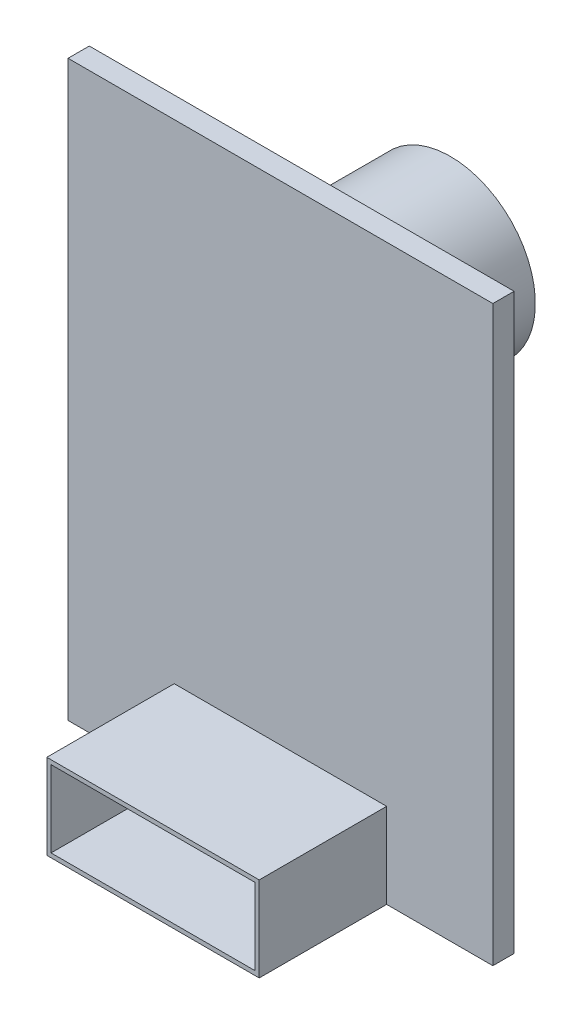
ISO-10303-21;
HEADER;
FILE_DESCRIPTION(('STEP AP214'),'2;1');
FILE_NAME('part.step','',(''),(''),'','','');
FILE_SCHEMA(('AUTOMOTIVE_DESIGN { 1 0 10303 214 1 1 1 1 }'));
ENDSEC;
DATA;
#1=APPLICATION_CONTEXT('core data for automotive mechanical design processes');
#2=APPLICATION_PROTOCOL_DEFINITION('international standard','automotive_design',2000,#1);
#3=PRODUCT_CONTEXT('',#1,'mechanical');
#4=PRODUCT('Part','Part','',(#3));
#5=PRODUCT_RELATED_PRODUCT_CATEGORY('part','',(#4));
#6=PRODUCT_DEFINITION_FORMATION('','',#4);
#7=PRODUCT_DEFINITION_CONTEXT('part definition',#1,'design');
#8=PRODUCT_DEFINITION('design','',#6,#7);
#9=PRODUCT_DEFINITION_SHAPE('','',#8);
#10=(LENGTH_UNIT() NAMED_UNIT(*) SI_UNIT(.MILLI.,.METRE.));
#11=(NAMED_UNIT(*) PLANE_ANGLE_UNIT() SI_UNIT($,.RADIAN.));
#12=(NAMED_UNIT(*) SI_UNIT($,.STERADIAN.) SOLID_ANGLE_UNIT());
#13=UNCERTAINTY_MEASURE_WITH_UNIT(LENGTH_MEASURE(1.E-05),#10,'distance_accuracy_value','');
#14=(GEOMETRIC_REPRESENTATION_CONTEXT(3) GLOBAL_UNCERTAINTY_ASSIGNED_CONTEXT((#13)) GLOBAL_UNIT_ASSIGNED_CONTEXT((#10,
#11,#12)) REPRESENTATION_CONTEXT('',''));
#15=CARTESIAN_POINT('',(0.,0.,0.));
#16=DIRECTION('',(0.,0.,1.));
#17=DIRECTION('',(1.,0.,0.));
#18=AXIS2_PLACEMENT_3D('',#15,#16,#17);
#19=CARTESIAN_POINT('',(0.,0.,-2.));
#20=DIRECTION('',(0.,0.,-1.));
#21=DIRECTION('',(-1.,0.,0.));
#22=AXIS2_PLACEMENT_3D('',#19,#20,#21);
#23=PLANE('',#22);
#24=DIRECTION('',(0.,-1.,0.));
#25=VECTOR('',#24,1.);
#26=CARTESIAN_POINT('',(-4.,10.5,-2.));
#27=LINE('',#26,#25);
#28=CARTESIAN_POINT('',(-4.,6.5,-2.));
#29=VERTEX_POINT('',#28);
#30=CARTESIAN_POINT('',(-4.,2.5,-2.));
#31=VERTEX_POINT('',#30);
#32=EDGE_CURVE('E262',#29,#31,#27,.T.);
#33=ORIENTED_EDGE('',*,*,#32,.F.);
#34=CARTESIAN_POINT('',(0.,6.5,-2.));
#35=DIRECTION('',(0.,0.,-1.));
#36=DIRECTION('',(-1.,0.,0.));
#37=AXIS2_PLACEMENT_3D('',#34,#35,#36);
#38=CIRCLE('',#37,4.);
#39=CARTESIAN_POINT('',(0.,2.5,-2.));
#40=VERTEX_POINT('',#39);
#41=EDGE_CURVE('E12',#29,#40,#38,.F.);
#42=ORIENTED_EDGE('',*,*,#41,.T.);
#43=DIRECTION('',(-1.,0.,0.));
#44=VECTOR('',#43,1.);
#45=CARTESIAN_POINT('',(4.,2.5,-2.));
#46=LINE('',#45,#44);
#47=EDGE_CURVE('E257',#40,#31,#46,.T.);
#48=ORIENTED_EDGE('',*,*,#47,.T.);
#49=EDGE_LOOP('',(#33,#42,#48));
#50=FACE_BOUND('',#49,.T.);
#51=ADVANCED_FACE('F57',(#50),#23,.T.);
#52=CARTESIAN_POINT('',(4.,2.5,-2.));
#53=VERTEX_POINT('',#52);
#54=EDGE_CURVE('E259',#53,#40,#46,.T.);
#55=ORIENTED_EDGE('',*,*,#54,.T.);
#56=CARTESIAN_POINT('',(4.,6.5,-2.));
#57=VERTEX_POINT('',#56);
#58=EDGE_CURVE('E66',#40,#57,#38,.F.);
#59=ORIENTED_EDGE('',*,*,#58,.T.);
#60=DIRECTION('',(0.,-1.,0.));
#61=VECTOR('',#60,1.);
#62=CARTESIAN_POINT('',(4.,10.5,-2.));
#63=LINE('',#62,#61);
#64=EDGE_CURVE('E258',#57,#53,#63,.T.);
#65=ORIENTED_EDGE('',*,*,#64,.T.);
#66=EDGE_LOOP('',(#55,#59,#65));
#67=FACE_BOUND('',#66,.T.);
#68=ADVANCED_FACE('F332',(#67),#23,.T.);
#69=CARTESIAN_POINT('',(4.,10.5,-2.));
#70=VERTEX_POINT('',#69);
#71=EDGE_CURVE('E254',#70,#57,#63,.T.);
#72=ORIENTED_EDGE('',*,*,#71,.T.);
#73=CARTESIAN_POINT('',(0.,10.5,-2.));
#74=VERTEX_POINT('',#73);
#75=EDGE_CURVE('E321',#57,#74,#38,.F.);
#76=ORIENTED_EDGE('',*,*,#75,.T.);
#77=DIRECTION('',(-1.,0.,0.));
#78=VECTOR('',#77,1.);
#79=CARTESIAN_POINT('',(4.,10.5,-2.));
#80=LINE('',#79,#78);
#81=EDGE_CURVE('E267',#70,#74,#80,.T.);
#82=ORIENTED_EDGE('',*,*,#81,.F.);
#83=EDGE_LOOP('',(#72,#76,#82));
#84=FACE_BOUND('',#83,.T.);
#85=ADVANCED_FACE('F339',(#84),#23,.T.);
#86=CARTESIAN_POINT('',(0.,0.,0.));
#87=DIRECTION('',(0.,0.,1.));
#88=DIRECTION('',(1.,0.,0.));
#89=AXIS2_PLACEMENT_3D('',#86,#87,#88);
#90=PLANE('',#89);
#91=DIRECTION('',(0.,1.,0.));
#92=VECTOR('',#91,1.);
#93=CARTESIAN_POINT('',(10.,13.5,0.));
#94=LINE('',#93,#92);
#95=CARTESIAN_POINT('',(10.,-13.5,0.));
#96=VERTEX_POINT('',#95);
#97=CARTESIAN_POINT('',(10.,13.5,0.));
#98=VERTEX_POINT('',#97);
#99=EDGE_CURVE('E289',#96,#98,#94,.T.);
#100=ORIENTED_EDGE('',*,*,#99,.F.);
#101=DIRECTION('',(1.,0.,0.));
#102=VECTOR('',#101,1.);
#103=CARTESIAN_POINT('',(-10.,-13.5,0.));
#104=LINE('',#103,#102);
#105=CARTESIAN_POINT('',(-10.,-13.5,0.));
#106=VERTEX_POINT('',#105);
#107=EDGE_CURVE('E294',#106,#96,#104,.T.);
#108=ORIENTED_EDGE('',*,*,#107,.F.);
#109=DIRECTION('',(0.,-1.,0.));
#110=VECTOR('',#109,1.);
#111=CARTESIAN_POINT('',(-10.,13.5,0.));
#112=LINE('',#111,#110);
#113=CARTESIAN_POINT('',(-10.,13.5,0.));
#114=VERTEX_POINT('',#113);
#115=EDGE_CURVE('E306',#114,#106,#112,.T.);
#116=ORIENTED_EDGE('',*,*,#115,.F.);
#117=DIRECTION('',(-1.,0.,0.));
#118=VECTOR('',#117,1.);
#119=CARTESIAN_POINT('',(-10.,13.5,0.));
#120=LINE('',#119,#118);
#121=EDGE_CURVE('E304',#98,#114,#120,.T.);
#122=ORIENTED_EDGE('',*,*,#121,.F.);
#123=EDGE_LOOP('',(#100,#108,#116,#122));
#124=FACE_BOUND('',#123,.T.);
#125=DIRECTION('',(0.,-1.,0.));
#126=VECTOR('',#125,1.);
#127=CARTESIAN_POINT('',(4.,10.5,0.));
#128=LINE('',#127,#126);
#129=CARTESIAN_POINT('',(4.,10.5,0.));
#130=VERTEX_POINT('',#129);
#131=CARTESIAN_POINT('',(4.,2.5,0.));
#132=VERTEX_POINT('',#131);
#133=EDGE_CURVE('E253',#130,#132,#128,.T.);
#134=ORIENTED_EDGE('',*,*,#133,.F.);
#135=DIRECTION('',(-1.,0.,0.));
#136=VECTOR('',#135,1.);
#137=CARTESIAN_POINT('',(4.,10.5,0.));
#138=LINE('',#137,#136);
#139=CARTESIAN_POINT('',(-4.,10.5,0.));
#140=VERTEX_POINT('',#139);
#141=EDGE_CURVE('E277',#130,#140,#138,.T.);
#142=ORIENTED_EDGE('',*,*,#141,.T.);
#143=DIRECTION('',(0.,-1.,0.));
#144=VECTOR('',#143,1.);
#145=CARTESIAN_POINT('',(-4.,10.5,0.));
#146=LINE('',#145,#144);
#147=CARTESIAN_POINT('',(-4.,2.5,0.));
#148=VERTEX_POINT('',#147);
#149=EDGE_CURVE('E274',#140,#148,#146,.T.);
#150=ORIENTED_EDGE('',*,*,#149,.T.);
#151=DIRECTION('',(-1.,0.,0.));
#152=VECTOR('',#151,1.);
#153=CARTESIAN_POINT('',(4.,2.5,0.));
#154=LINE('',#153,#152);
#155=EDGE_CURVE('E272',#132,#148,#154,.T.);
#156=ORIENTED_EDGE('',*,*,#155,.F.);
#157=EDGE_LOOP('',(#134,#142,#150,#156));
#158=FACE_BOUND('',#157,.T.);
#159=ADVANCED_FACE('F351',(#124,#158),#90,.F.);
#160=CARTESIAN_POINT('',(10.,13.5,1.));
#161=DIRECTION('',(-1.,0.,0.));
#162=DIRECTION('',(0.,-1.,0.));
#163=AXIS2_PLACEMENT_3D('',#160,#161,#162);
#164=PLANE('',#163);
#165=ORIENTED_EDGE('',*,*,#99,.T.);
#166=DIRECTION('',(0.,0.,-1.));
#167=VECTOR('',#166,1.);
#168=CARTESIAN_POINT('',(10.,13.5,1.));
#169=LINE('',#168,#167);
#170=CARTESIAN_POINT('',(10.,13.5,1.));
#171=VERTEX_POINT('',#170);
#172=EDGE_CURVE('E316',#171,#98,#169,.T.);
#173=ORIENTED_EDGE('',*,*,#172,.F.);
#174=DIRECTION('',(0.,1.,0.));
#175=VECTOR('',#174,1.);
#176=CARTESIAN_POINT('',(10.,13.5,1.));
#177=LINE('',#176,#175);
#178=CARTESIAN_POINT('',(10.,-13.5,1.));
#179=VERTEX_POINT('',#178);
#180=EDGE_CURVE('E290',#179,#171,#177,.T.);
#181=ORIENTED_EDGE('',*,*,#180,.F.);
#182=DIRECTION('',(0.,0.,-1.));
#183=VECTOR('',#182,1.);
#184=CARTESIAN_POINT('',(10.,-13.5,1.));
#185=LINE('',#184,#183);
#186=EDGE_CURVE('E301',#179,#96,#185,.T.);
#187=ORIENTED_EDGE('',*,*,#186,.T.);
#188=EDGE_LOOP('',(#165,#173,#181,#187));
#189=FACE_BOUND('',#188,.T.);
#190=ADVANCED_FACE('F59',(#189),#164,.F.);
#191=CARTESIAN_POINT('',(-10.,13.5,1.));
#192=DIRECTION('',(0.,-1.,0.));
#193=DIRECTION('',(0.,0.,-1.));
#194=AXIS2_PLACEMENT_3D('',#191,#192,#193);
#195=PLANE('',#194);
#196=ORIENTED_EDGE('',*,*,#121,.T.);
#197=DIRECTION('',(0.,0.,-1.));
#198=VECTOR('',#197,1.);
#199=CARTESIAN_POINT('',(-10.,13.5,1.));
#200=LINE('',#199,#198);
#201=CARTESIAN_POINT('',(-10.,13.5,1.));
#202=VERTEX_POINT('',#201);
#203=EDGE_CURVE('E314',#202,#114,#200,.T.);
#204=ORIENTED_EDGE('',*,*,#203,.F.);
#205=DIRECTION('',(-1.,0.,0.));
#206=VECTOR('',#205,1.);
#207=CARTESIAN_POINT('',(-10.,13.5,1.));
#208=LINE('',#207,#206);
#209=EDGE_CURVE('E293',#171,#202,#208,.T.);
#210=ORIENTED_EDGE('',*,*,#209,.F.);
#211=ORIENTED_EDGE('',*,*,#172,.T.);
#212=EDGE_LOOP('',(#196,#204,#210,#211));
#213=FACE_BOUND('',#212,.T.);
#214=ADVANCED_FACE('F393',(#213),#195,.F.);
#215=CARTESIAN_POINT('',(-10.,13.5,1.));
#216=DIRECTION('',(1.,0.,0.));
#217=DIRECTION('',(0.,1.,0.));
#218=AXIS2_PLACEMENT_3D('',#215,#216,#217);
#219=PLANE('',#218);
#220=ORIENTED_EDGE('',*,*,#115,.T.);
#221=DIRECTION('',(0.,0.,-1.));
#222=VECTOR('',#221,1.);
#223=CARTESIAN_POINT('',(-10.,-13.5,1.));
#224=LINE('',#223,#222);
#225=CARTESIAN_POINT('',(-10.,-13.5,1.));
#226=VERTEX_POINT('',#225);
#227=EDGE_CURVE('E311',#226,#106,#224,.T.);
#228=ORIENTED_EDGE('',*,*,#227,.F.);
#229=DIRECTION('',(0.,-1.,0.));
#230=VECTOR('',#229,1.);
#231=CARTESIAN_POINT('',(-10.,13.5,1.));
#232=LINE('',#231,#230);
#233=EDGE_CURVE('E296',#202,#226,#232,.T.);
#234=ORIENTED_EDGE('',*,*,#233,.F.);
#235=ORIENTED_EDGE('',*,*,#203,.T.);
#236=EDGE_LOOP('',(#220,#228,#234,#235));
#237=FACE_BOUND('',#236,.T.);
#238=ADVANCED_FACE('F403',(#237),#219,.F.);
#239=CARTESIAN_POINT('',(-10.,-13.5,1.));
#240=DIRECTION('',(0.,1.,0.));
#241=DIRECTION('',(0.,0.,1.));
#242=AXIS2_PLACEMENT_3D('',#239,#240,#241);
#243=PLANE('',#242);
#244=ORIENTED_EDGE('',*,*,#107,.T.);
#245=ORIENTED_EDGE('',*,*,#186,.F.);
#246=DIRECTION('',(1.,0.,0.));
#247=VECTOR('',#246,1.);
#248=CARTESIAN_POINT('',(-10.,-13.5,1.));
#249=LINE('',#248,#247);
#250=CARTESIAN_POINT('',(5.,-13.5,1.));
#251=VERTEX_POINT('',#250);
#252=EDGE_CURVE('E298',#251,#179,#249,.T.);
#253=ORIENTED_EDGE('',*,*,#252,.F.);
#254=DIRECTION('',(0.,0.,-1.));
#255=VECTOR('',#254,1.);
#256=CARTESIAN_POINT('',(5.,-13.5,7.));
#257=LINE('',#256,#255);
#258=CARTESIAN_POINT('',(5.,-13.5,7.));
#259=VERTEX_POINT('',#258);
#260=EDGE_CURVE('E234',#259,#251,#257,.T.);
#261=ORIENTED_EDGE('',*,*,#260,.F.);
#262=DIRECTION('',(1.,0.,0.));
#263=VECTOR('',#262,1.);
#264=CARTESIAN_POINT('',(-5.,-13.5,7.));
#265=LINE('',#264,#263);
#266=CARTESIAN_POINT('',(-5.,-13.5,7.));
#267=VERTEX_POINT('',#266);
#268=EDGE_CURVE('E232',#267,#259,#265,.T.);
#269=ORIENTED_EDGE('',*,*,#268,.F.);
#270=DIRECTION('',(0.,0.,-1.));
#271=VECTOR('',#270,1.);
#272=CARTESIAN_POINT('',(-5.,-13.5,7.));
#273=LINE('',#272,#271);
#274=CARTESIAN_POINT('',(-5.,-13.5,1.));
#275=VERTEX_POINT('',#274);
#276=EDGE_CURVE('E242',#267,#275,#273,.T.);
#277=ORIENTED_EDGE('',*,*,#276,.T.);
#278=EDGE_CURVE('E299',#226,#275,#249,.T.);
#279=ORIENTED_EDGE('',*,*,#278,.F.);
#280=ORIENTED_EDGE('',*,*,#227,.T.);
#281=EDGE_LOOP('',(#244,#245,#253,#261,#269,#277,#279,#280));
#282=FACE_BOUND('',#281,.T.);
#283=ADVANCED_FACE('F400',(#282),#243,.F.);
#284=CARTESIAN_POINT('',(0.,0.,1.));
#285=DIRECTION('',(0.,0.,1.));
#286=DIRECTION('',(1.,0.,0.));
#287=AXIS2_PLACEMENT_3D('',#284,#285,#286);
#288=PLANE('',#287);
#289=DIRECTION('',(0.,1.,0.));
#290=VECTOR('',#289,1.);
#291=CARTESIAN_POINT('',(5.,-9.5,1.));
#292=LINE('',#291,#290);
#293=CARTESIAN_POINT('',(5.,-9.5,1.));
#294=VERTEX_POINT('',#293);
#295=EDGE_CURVE('E200',#251,#294,#292,.T.);
#296=ORIENTED_EDGE('',*,*,#295,.F.);
#297=ORIENTED_EDGE('',*,*,#252,.T.);
#298=ORIENTED_EDGE('',*,*,#180,.T.);
#299=ORIENTED_EDGE('',*,*,#209,.T.);
#300=ORIENTED_EDGE('',*,*,#233,.T.);
#301=ORIENTED_EDGE('',*,*,#278,.T.);
#302=DIRECTION('',(0.,-1.,0.));
#303=VECTOR('',#302,1.);
#304=CARTESIAN_POINT('',(-5.,-9.5,1.));
#305=LINE('',#304,#303);
#306=CARTESIAN_POINT('',(-5.,-9.5,1.));
#307=VERTEX_POINT('',#306);
#308=EDGE_CURVE('E228',#307,#275,#305,.T.);
#309=ORIENTED_EDGE('',*,*,#308,.F.);
#310=DIRECTION('',(-1.,0.,0.));
#311=VECTOR('',#310,1.);
#312=CARTESIAN_POINT('',(-5.,-9.5,1.));
#313=LINE('',#312,#311);
#314=EDGE_CURVE('E73',#294,#307,#313,.T.);
#315=ORIENTED_EDGE('',*,*,#314,.F.);
#316=EDGE_LOOP('',(#296,#297,#298,#299,#300,#301,#309,#315));
#317=FACE_BOUND('',#316,.T.);
#318=ADVANCED_FACE('F398',(#317),#288,.T.);
#319=CARTESIAN_POINT('',(4.,10.5,-2.));
#320=DIRECTION('',(-1.,0.,0.));
#321=DIRECTION('',(0.,0.,1.));
#322=AXIS2_PLACEMENT_3D('',#319,#320,#321);
#323=PLANE('',#322);
#324=ORIENTED_EDGE('',*,*,#133,.T.);
#325=DIRECTION('',(0.,0.,1.));
#326=VECTOR('',#325,1.);
#327=CARTESIAN_POINT('',(4.,2.5,-2.));
#328=LINE('',#327,#326);
#329=EDGE_CURVE('E286',#53,#132,#328,.T.);
#330=ORIENTED_EDGE('',*,*,#329,.F.);
#331=ORIENTED_EDGE('',*,*,#64,.F.);
#332=ORIENTED_EDGE('',*,*,#71,.F.);
#333=DIRECTION('',(0.,0.,1.));
#334=VECTOR('',#333,1.);
#335=CARTESIAN_POINT('',(4.,10.5,-2.));
#336=LINE('',#335,#334);
#337=EDGE_CURVE('E270',#70,#130,#336,.T.);
#338=ORIENTED_EDGE('',*,*,#337,.T.);
#339=EDGE_LOOP('',(#324,#330,#331,#332,#338));
#340=FACE_BOUND('',#339,.T.);
#341=ADVANCED_FACE('F338',(#340),#323,.F.);
#342=CARTESIAN_POINT('',(4.,2.5,-2.));
#343=DIRECTION('',(0.,1.,0.));
#344=DIRECTION('',(0.,0.,1.));
#345=AXIS2_PLACEMENT_3D('',#342,#343,#344);
#346=PLANE('',#345);
#347=ORIENTED_EDGE('',*,*,#155,.T.);
#348=DIRECTION('',(0.,0.,1.));
#349=VECTOR('',#348,1.);
#350=CARTESIAN_POINT('',(-4.,2.5,-2.));
#351=LINE('',#350,#349);
#352=EDGE_CURVE('E283',#31,#148,#351,.T.);
#353=ORIENTED_EDGE('',*,*,#352,.F.);
#354=ORIENTED_EDGE('',*,*,#47,.F.);
#355=ORIENTED_EDGE('',*,*,#54,.F.);
#356=ORIENTED_EDGE('',*,*,#329,.T.);
#357=EDGE_LOOP('',(#347,#353,#354,#355,#356));
#358=FACE_BOUND('',#357,.T.);
#359=ADVANCED_FACE('F348',(#358),#346,.F.);
#360=CARTESIAN_POINT('',(-4.,10.5,-2.));
#361=DIRECTION('',(-1.,0.,0.));
#362=DIRECTION('',(0.,0.,1.));
#363=AXIS2_PLACEMENT_3D('',#360,#361,#362);
#364=PLANE('',#363);
#365=CARTESIAN_POINT('',(-4.,10.5,-2.));
#366=VERTEX_POINT('',#365);
#367=EDGE_CURVE('E263',#366,#29,#27,.T.);
#368=ORIENTED_EDGE('',*,*,#367,.T.);
#369=ORIENTED_EDGE('',*,*,#32,.T.);
#370=ORIENTED_EDGE('',*,*,#352,.T.);
#371=ORIENTED_EDGE('',*,*,#149,.F.);
#372=DIRECTION('',(0.,0.,1.));
#373=VECTOR('',#372,1.);
#374=CARTESIAN_POINT('',(-4.,10.5,-2.));
#375=LINE('',#374,#373);
#376=EDGE_CURVE('E280',#366,#140,#375,.T.);
#377=ORIENTED_EDGE('',*,*,#376,.F.);
#378=EDGE_LOOP('',(#368,#369,#370,#371,#377));
#379=FACE_BOUND('',#378,.T.);
#380=ADVANCED_FACE('F354',(#379),#364,.T.);
#381=CARTESIAN_POINT('',(4.,10.5,-2.));
#382=DIRECTION('',(0.,1.,0.));
#383=DIRECTION('',(0.,0.,1.));
#384=AXIS2_PLACEMENT_3D('',#381,#382,#383);
#385=PLANE('',#384);
#386=ORIENTED_EDGE('',*,*,#81,.T.);
#387=EDGE_CURVE('E266',#74,#366,#80,.T.);
#388=ORIENTED_EDGE('',*,*,#387,.T.);
#389=ORIENTED_EDGE('',*,*,#376,.T.);
#390=ORIENTED_EDGE('',*,*,#141,.F.);
#391=ORIENTED_EDGE('',*,*,#337,.F.);
#392=EDGE_LOOP('',(#386,#388,#389,#390,#391));
#393=FACE_BOUND('',#392,.T.);
#394=ADVANCED_FACE('F341',(#393),#385,.T.);
#395=ORIENTED_EDGE('',*,*,#387,.F.);
#396=EDGE_CURVE('E61',#74,#29,#38,.F.);
#397=ORIENTED_EDGE('',*,*,#396,.T.);
#398=ORIENTED_EDGE('',*,*,#367,.F.);
#399=EDGE_LOOP('',(#395,#397,#398));
#400=FACE_BOUND('',#399,.T.);
#401=ADVANCED_FACE('F361',(#400),#23,.T.);
#402=CARTESIAN_POINT('',(0.,6.5,-7.));
#403=DIRECTION('',(0.,0.,1.));
#404=DIRECTION('',(1.,0.,0.));
#405=AXIS2_PLACEMENT_3D('',#402,#403,#404);
#406=CYLINDRICAL_SURFACE('',#405,4.);
#407=ORIENTED_EDGE('',*,*,#41,.F.);
#408=ORIENTED_EDGE('',*,*,#396,.F.);
#409=ORIENTED_EDGE('',*,*,#75,.F.);
#410=ORIENTED_EDGE('',*,*,#58,.F.);
#411=EDGE_LOOP('',(#407,#408,#409,#410));
#412=FACE_BOUND('',#411,.T.);
#413=CARTESIAN_POINT('',(0.,6.5,-7.));
#414=DIRECTION('',(0.,0.,-1.));
#415=DIRECTION('',(-1.,0.,0.));
#416=AXIS2_PLACEMENT_3D('',#413,#414,#415);
#417=CIRCLE('',#416,4.);
#418=CARTESIAN_POINT('',(-4.,6.5,-7.));
#419=VERTEX_POINT('',#418);
#420=EDGE_CURVE('E250',#419,#419,#417,.T.);
#421=ORIENTED_EDGE('',*,*,#420,.F.);
#422=EDGE_LOOP('',(#421));
#423=FACE_BOUND('',#422,.T.);
#424=ADVANCED_FACE('F357',(#412,#423),#406,.T.);
#425=CARTESIAN_POINT('',(0.,6.5,-7.));
#426=DIRECTION('',(0.,0.,-1.));
#427=DIRECTION('',(-1.,0.,0.));
#428=AXIS2_PLACEMENT_3D('',#425,#426,#427);
#429=PLANE('',#428);
#430=ORIENTED_EDGE('',*,*,#420,.T.);
#431=EDGE_LOOP('',(#430));
#432=FACE_BOUND('',#431,.T.);
#433=ADVANCED_FACE('F360',(#432),#429,.T.);
#434=CARTESIAN_POINT('',(0.,0.,7.));
#435=DIRECTION('',(0.,0.,1.));
#436=DIRECTION('',(1.,0.,0.));
#437=AXIS2_PLACEMENT_3D('',#434,#435,#436);
#438=PLANE('',#437);
#439=DIRECTION('',(0.,1.,0.));
#440=VECTOR('',#439,1.);
#441=CARTESIAN_POINT('',(5.,-9.5,7.));
#442=LINE('',#441,#440);
#443=CARTESIAN_POINT('',(5.,-9.5,7.));
#444=VERTEX_POINT('',#443);
#445=EDGE_CURVE('E224',#259,#444,#442,.T.);
#446=ORIENTED_EDGE('',*,*,#445,.T.);
#447=DIRECTION('',(-1.,0.,0.));
#448=VECTOR('',#447,1.);
#449=CARTESIAN_POINT('',(-5.,-9.5,7.));
#450=LINE('',#449,#448);
#451=CARTESIAN_POINT('',(-5.,-9.5,7.));
#452=VERTEX_POINT('',#451);
#453=EDGE_CURVE('E227',#444,#452,#450,.T.);
#454=ORIENTED_EDGE('',*,*,#453,.T.);
#455=DIRECTION('',(0.,-1.,0.));
#456=VECTOR('',#455,1.);
#457=CARTESIAN_POINT('',(-5.,-9.5,7.));
#458=LINE('',#457,#456);
#459=EDGE_CURVE('E230',#452,#267,#458,.T.);
#460=ORIENTED_EDGE('',*,*,#459,.T.);
#461=ORIENTED_EDGE('',*,*,#268,.T.);
#462=EDGE_LOOP('',(#446,#454,#460,#461));
#463=FACE_BOUND('',#462,.T.);
#464=DIRECTION('',(-1.,0.,0.));
#465=VECTOR('',#464,1.);
#466=CARTESIAN_POINT('',(-5.,-9.7,7.));
#467=LINE('',#466,#465);
#468=CARTESIAN_POINT('',(4.8,-9.7,7.));
#469=VERTEX_POINT('',#468);
#470=CARTESIAN_POINT('',(-4.8,-9.7,7.));
#471=VERTEX_POINT('',#470);
#472=EDGE_CURVE('E192',#469,#471,#467,.T.);
#473=ORIENTED_EDGE('',*,*,#472,.F.);
#474=DIRECTION('',(0.,1.,0.));
#475=VECTOR('',#474,1.);
#476=CARTESIAN_POINT('',(4.8,-9.5,7.));
#477=LINE('',#476,#475);
#478=CARTESIAN_POINT('',(4.8,-13.3,7.));
#479=VERTEX_POINT('',#478);
#480=EDGE_CURVE('E184',#479,#469,#477,.T.);
#481=ORIENTED_EDGE('',*,*,#480,.F.);
#482=DIRECTION('',(1.,0.,0.));
#483=VECTOR('',#482,1.);
#484=CARTESIAN_POINT('',(-5.,-13.3,7.));
#485=LINE('',#484,#483);
#486=CARTESIAN_POINT('',(-4.8,-13.3,7.));
#487=VERTEX_POINT('',#486);
#488=EDGE_CURVE('E208',#487,#479,#485,.T.);
#489=ORIENTED_EDGE('',*,*,#488,.F.);
#490=DIRECTION('',(0.,-1.,0.));
#491=VECTOR('',#490,1.);
#492=CARTESIAN_POINT('',(-4.8,-9.5,7.));
#493=LINE('',#492,#491);
#494=EDGE_CURVE('E206',#471,#487,#493,.T.);
#495=ORIENTED_EDGE('',*,*,#494,.F.);
#496=EDGE_LOOP('',(#473,#481,#489,#495));
#497=FACE_BOUND('',#496,.T.);
#498=ADVANCED_FACE('F204',(#463,#497),#438,.T.);
#499=CARTESIAN_POINT('',(5.,-9.5,7.));
#500=DIRECTION('',(-1.,0.,0.));
#501=DIRECTION('',(0.,-1.,0.));
#502=AXIS2_PLACEMENT_3D('',#499,#500,#501);
#503=PLANE('',#502);
#504=ORIENTED_EDGE('',*,*,#295,.T.);
#505=DIRECTION('',(0.,0.,-1.));
#506=VECTOR('',#505,1.);
#507=CARTESIAN_POINT('',(5.,-9.5,7.));
#508=LINE('',#507,#506);
#509=EDGE_CURVE('E248',#444,#294,#508,.T.);
#510=ORIENTED_EDGE('',*,*,#509,.F.);
#511=ORIENTED_EDGE('',*,*,#445,.F.);
#512=ORIENTED_EDGE('',*,*,#260,.T.);
#513=EDGE_LOOP('',(#504,#510,#511,#512));
#514=FACE_BOUND('',#513,.T.);
#515=ADVANCED_FACE('F370',(#514),#503,.F.);
#516=CARTESIAN_POINT('',(-5.,-9.5,7.));
#517=DIRECTION('',(0.,-1.,0.));
#518=DIRECTION('',(0.,0.,-1.));
#519=AXIS2_PLACEMENT_3D('',#516,#517,#518);
#520=PLANE('',#519);
#521=ORIENTED_EDGE('',*,*,#314,.T.);
#522=DIRECTION('',(0.,0.,-1.));
#523=VECTOR('',#522,1.);
#524=CARTESIAN_POINT('',(-5.,-9.5,7.));
#525=LINE('',#524,#523);
#526=EDGE_CURVE('E245',#452,#307,#525,.T.);
#527=ORIENTED_EDGE('',*,*,#526,.F.);
#528=ORIENTED_EDGE('',*,*,#453,.F.);
#529=ORIENTED_EDGE('',*,*,#509,.T.);
#530=EDGE_LOOP('',(#521,#527,#528,#529));
#531=FACE_BOUND('',#530,.T.);
#532=ADVANCED_FACE('F430',(#531),#520,.F.);
#533=CARTESIAN_POINT('',(-5.,-9.5,7.));
#534=DIRECTION('',(1.,0.,0.));
#535=DIRECTION('',(0.,1.,0.));
#536=AXIS2_PLACEMENT_3D('',#533,#534,#535);
#537=PLANE('',#536);
#538=ORIENTED_EDGE('',*,*,#308,.T.);
#539=ORIENTED_EDGE('',*,*,#276,.F.);
#540=ORIENTED_EDGE('',*,*,#459,.F.);
#541=ORIENTED_EDGE('',*,*,#526,.T.);
#542=EDGE_LOOP('',(#538,#539,#540,#541));
#543=FACE_BOUND('',#542,.T.);
#544=ADVANCED_FACE('F428',(#543),#537,.F.);
#545=CARTESIAN_POINT('',(4.8,-9.5,7.));
#546=DIRECTION('',(-1.,0.,0.));
#547=DIRECTION('',(0.,-1.,0.));
#548=AXIS2_PLACEMENT_3D('',#545,#546,#547);
#549=PLANE('',#548);
#550=DIRECTION('',(0.,1.,0.));
#551=VECTOR('',#550,1.);
#552=CARTESIAN_POINT('',(4.8,-9.5,1.));
#553=LINE('',#552,#551);
#554=CARTESIAN_POINT('',(4.8,-13.3,1.));
#555=VERTEX_POINT('',#554);
#556=CARTESIAN_POINT('',(4.8,-9.7,1.));
#557=VERTEX_POINT('',#556);
#558=EDGE_CURVE('E212',#555,#557,#553,.T.);
#559=ORIENTED_EDGE('',*,*,#558,.F.);
#560=DIRECTION('',(0.,0.,-1.));
#561=VECTOR('',#560,1.);
#562=CARTESIAN_POINT('',(4.8,-13.3,7.));
#563=LINE('',#562,#561);
#564=EDGE_CURVE('E81',#479,#555,#563,.T.);
#565=ORIENTED_EDGE('',*,*,#564,.F.);
#566=ORIENTED_EDGE('',*,*,#480,.T.);
#567=DIRECTION('',(0.,0.,-1.));
#568=VECTOR('',#567,1.);
#569=CARTESIAN_POINT('',(4.8,-9.7,7.));
#570=LINE('',#569,#568);
#571=EDGE_CURVE('E187',#469,#557,#570,.T.);
#572=ORIENTED_EDGE('',*,*,#571,.T.);
#573=EDGE_LOOP('',(#559,#565,#566,#572));
#574=FACE_BOUND('',#573,.T.);
#575=ADVANCED_FACE('F186',(#574),#549,.T.);
#576=CARTESIAN_POINT('',(-5.,-9.7,7.));
#577=DIRECTION('',(0.,-1.,0.));
#578=DIRECTION('',(0.,0.,-1.));
#579=AXIS2_PLACEMENT_3D('',#576,#577,#578);
#580=PLANE('',#579);
#581=DIRECTION('',(-1.,0.,0.));
#582=VECTOR('',#581,1.);
#583=CARTESIAN_POINT('',(-5.,-9.7,1.));
#584=LINE('',#583,#582);
#585=CARTESIAN_POINT('',(-4.8,-9.7,1.));
#586=VERTEX_POINT('',#585);
#587=EDGE_CURVE('E199',#557,#586,#584,.T.);
#588=ORIENTED_EDGE('',*,*,#587,.F.);
#589=ORIENTED_EDGE('',*,*,#571,.F.);
#590=ORIENTED_EDGE('',*,*,#472,.T.);
#591=DIRECTION('',(0.,0.,-1.));
#592=VECTOR('',#591,1.);
#593=CARTESIAN_POINT('',(-4.8,-9.7,7.));
#594=LINE('',#593,#592);
#595=EDGE_CURVE('E201',#471,#586,#594,.T.);
#596=ORIENTED_EDGE('',*,*,#595,.T.);
#597=EDGE_LOOP('',(#588,#589,#590,#596));
#598=FACE_BOUND('',#597,.T.);
#599=ADVANCED_FACE('F196',(#598),#580,.T.);
#600=CARTESIAN_POINT('',(-4.8,-9.5,7.));
#601=DIRECTION('',(1.,0.,0.));
#602=DIRECTION('',(0.,1.,0.));
#603=AXIS2_PLACEMENT_3D('',#600,#601,#602);
#604=PLANE('',#603);
#605=DIRECTION('',(0.,-1.,0.));
#606=VECTOR('',#605,1.);
#607=CARTESIAN_POINT('',(-4.8,-9.5,1.));
#608=LINE('',#607,#606);
#609=CARTESIAN_POINT('',(-4.8,-13.3,1.));
#610=VERTEX_POINT('',#609);
#611=EDGE_CURVE('E215',#586,#610,#608,.T.);
#612=ORIENTED_EDGE('',*,*,#611,.F.);
#613=ORIENTED_EDGE('',*,*,#595,.F.);
#614=ORIENTED_EDGE('',*,*,#494,.T.);
#615=DIRECTION('',(0.,0.,-1.));
#616=VECTOR('',#615,1.);
#617=CARTESIAN_POINT('',(-4.8,-13.3,7.));
#618=LINE('',#617,#616);
#619=EDGE_CURVE('E221',#487,#610,#618,.T.);
#620=ORIENTED_EDGE('',*,*,#619,.T.);
#621=EDGE_LOOP('',(#612,#613,#614,#620));
#622=FACE_BOUND('',#621,.T.);
#623=ADVANCED_FACE('F443',(#622),#604,.T.);
#624=CARTESIAN_POINT('',(-5.,-13.3,7.));
#625=DIRECTION('',(0.,1.,0.));
#626=DIRECTION('',(0.,0.,1.));
#627=AXIS2_PLACEMENT_3D('',#624,#625,#626);
#628=PLANE('',#627);
#629=DIRECTION('',(1.,0.,0.));
#630=VECTOR('',#629,1.);
#631=CARTESIAN_POINT('',(-5.,-13.3,1.));
#632=LINE('',#631,#630);
#633=EDGE_CURVE('E193',#610,#555,#632,.T.);
#634=ORIENTED_EDGE('',*,*,#633,.F.);
#635=ORIENTED_EDGE('',*,*,#619,.F.);
#636=ORIENTED_EDGE('',*,*,#488,.T.);
#637=ORIENTED_EDGE('',*,*,#564,.T.);
#638=EDGE_LOOP('',(#634,#635,#636,#637));
#639=FACE_BOUND('',#638,.T.);
#640=ADVANCED_FACE('F446',(#639),#628,.T.);
#641=ORIENTED_EDGE('',*,*,#633,.T.);
#642=ORIENTED_EDGE('',*,*,#558,.T.);
#643=ORIENTED_EDGE('',*,*,#587,.T.);
#644=ORIENTED_EDGE('',*,*,#611,.T.);
#645=EDGE_LOOP('',(#641,#642,#643,#644));
#646=FACE_BOUND('',#645,.T.);
#647=ADVANCED_FACE('F449',(#646),#288,.T.);
#648=CLOSED_SHELL('',(#51,#68,#85,#159,#190,#214,#238,#283,#318,#341,#359,#380,#394,#401,#424,
#433,#498,#515,#532,#544,#575,#599,#623,#640,#647));
#649=MANIFOLD_SOLID_BREP('B2',#648);
#650=ADVANCED_BREP_SHAPE_REPRESENTATION('',(#18,#649),#14);
#651=SHAPE_DEFINITION_REPRESENTATION(#9,#650);
ENDSEC;
END-ISO-10303-21;
